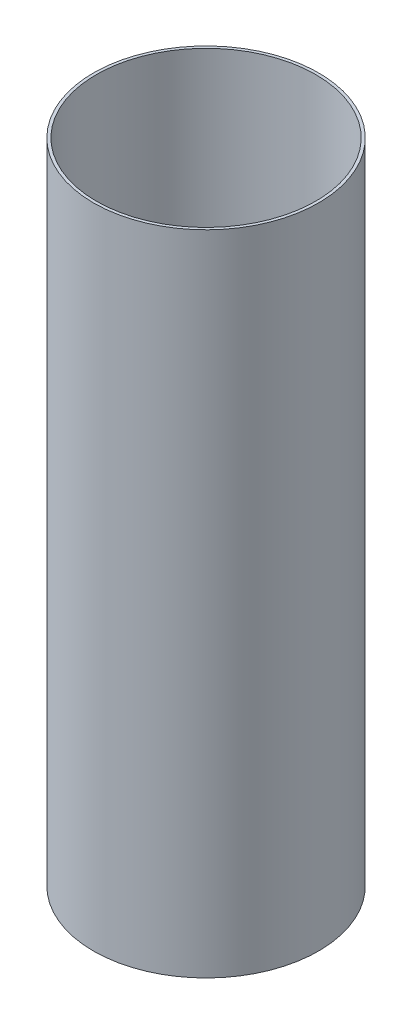
ISO-10303-21;
HEADER;
FILE_DESCRIPTION(('STEP AP214'),'2;1');
FILE_NAME('part.step','',(''),(''),'','','');
FILE_SCHEMA(('AUTOMOTIVE_DESIGN { 1 0 10303 214 1 1 1 1 }'));
ENDSEC;
DATA;
#1=APPLICATION_CONTEXT('core data for automotive mechanical design processes');
#2=APPLICATION_PROTOCOL_DEFINITION('international standard','automotive_design',2000,#1);
#3=PRODUCT_CONTEXT('',#1,'mechanical');
#4=PRODUCT('Part','Part','',(#3));
#5=PRODUCT_RELATED_PRODUCT_CATEGORY('part','',(#4));
#6=PRODUCT_DEFINITION_FORMATION('','',#4);
#7=PRODUCT_DEFINITION_CONTEXT('part definition',#1,'design');
#8=PRODUCT_DEFINITION('design','',#6,#7);
#9=PRODUCT_DEFINITION_SHAPE('','',#8);
#10=(LENGTH_UNIT() NAMED_UNIT(*) SI_UNIT(.MILLI.,.METRE.));
#11=(NAMED_UNIT(*) PLANE_ANGLE_UNIT() SI_UNIT($,.RADIAN.));
#12=(NAMED_UNIT(*) SI_UNIT($,.STERADIAN.) SOLID_ANGLE_UNIT());
#13=UNCERTAINTY_MEASURE_WITH_UNIT(LENGTH_MEASURE(1.E-05),#10,'distance_accuracy_value','');
#14=(GEOMETRIC_REPRESENTATION_CONTEXT(3) GLOBAL_UNCERTAINTY_ASSIGNED_CONTEXT((#13)) GLOBAL_UNIT_ASSIGNED_CONTEXT((#10,
#11,#12)) REPRESENTATION_CONTEXT('',''));
#15=CARTESIAN_POINT('',(0.,0.,0.));
#16=DIRECTION('',(0.,0.,1.));
#17=DIRECTION('',(1.,0.,0.));
#18=AXIS2_PLACEMENT_3D('',#15,#16,#17);
#19=CARTESIAN_POINT('',(0.,450.,0.));
#20=DIRECTION('',(0.,1.,0.));
#21=DIRECTION('',(0.,0.,1.));
#22=AXIS2_PLACEMENT_3D('',#19,#20,#21);
#23=PLANE('',#22);
#24=CARTESIAN_POINT('',(0.,450.,0.));
#25=DIRECTION('',(0.,1.,0.));
#26=DIRECTION('',(0.,0.,1.));
#27=AXIS2_PLACEMENT_3D('',#24,#25,#26);
#28=CIRCLE('',#27,78.2);
#29=CARTESIAN_POINT('',(0.,450.,78.2));
#30=VERTEX_POINT('',#29);
#31=EDGE_CURVE('E10',#30,#30,#28,.T.);
#32=ORIENTED_EDGE('',*,*,#31,.T.);
#33=EDGE_LOOP('',(#32));
#34=FACE_BOUND('',#33,.T.);
#35=CARTESIAN_POINT('',(0.,450.,0.));
#36=DIRECTION('',(0.,1.,0.));
#37=DIRECTION('',(0.,0.,1.));
#38=AXIS2_PLACEMENT_3D('',#35,#36,#37);
#39=CIRCLE('',#38,76.2);
#40=CARTESIAN_POINT('',(0.,450.,76.2));
#41=VERTEX_POINT('',#40);
#42=EDGE_CURVE('E50',#41,#41,#39,.T.);
#43=ORIENTED_EDGE('',*,*,#42,.F.);
#44=EDGE_LOOP('',(#43));
#45=FACE_BOUND('',#44,.T.);
#46=ADVANCED_FACE('F37',(#34,#45),#23,.T.);
#47=CARTESIAN_POINT('',(0.,0.,0.));
#48=DIRECTION('',(0.,1.,0.));
#49=DIRECTION('',(0.,0.,1.));
#50=AXIS2_PLACEMENT_3D('',#47,#48,#49);
#51=PLANE('',#50);
#52=CARTESIAN_POINT('',(0.,0.,0.));
#53=DIRECTION('',(0.,1.,0.));
#54=DIRECTION('',(0.,0.,1.));
#55=AXIS2_PLACEMENT_3D('',#52,#53,#54);
#56=CIRCLE('',#55,78.2);
#57=CARTESIAN_POINT('',(0.,0.,78.2));
#58=VERTEX_POINT('',#57);
#59=EDGE_CURVE('E41',#58,#58,#56,.T.);
#60=ORIENTED_EDGE('',*,*,#59,.F.);
#61=EDGE_LOOP('',(#60));
#62=FACE_BOUND('',#61,.T.);
#63=CARTESIAN_POINT('',(0.,0.,0.));
#64=DIRECTION('',(0.,1.,0.));
#65=DIRECTION('',(0.,0.,1.));
#66=AXIS2_PLACEMENT_3D('',#63,#64,#65);
#67=CIRCLE('',#66,76.2);
#68=CARTESIAN_POINT('',(0.,0.,76.2));
#69=VERTEX_POINT('',#68);
#70=EDGE_CURVE('E52',#69,#69,#67,.T.);
#71=ORIENTED_EDGE('',*,*,#70,.T.);
#72=EDGE_LOOP('',(#71));
#73=FACE_BOUND('',#72,.T.);
#74=ADVANCED_FACE('F64',(#62,#73),#51,.F.);
#75=CARTESIAN_POINT('',(0.,450.,0.));
#76=DIRECTION('',(0.,-1.,0.));
#77=DIRECTION('',(0.,0.,-1.));
#78=AXIS2_PLACEMENT_3D('',#75,#76,#77);
#79=CYLINDRICAL_SURFACE('',#78,78.2);
#80=ORIENTED_EDGE('',*,*,#31,.F.);
#81=EDGE_LOOP('',(#80));
#82=FACE_BOUND('',#81,.T.);
#83=ORIENTED_EDGE('',*,*,#59,.T.);
#84=EDGE_LOOP('',(#83));
#85=FACE_BOUND('',#84,.T.);
#86=ADVANCED_FACE('F39',(#82,#85),#79,.T.);
#87=CARTESIAN_POINT('',(0.,450.,0.));
#88=DIRECTION('',(0.,-1.,0.));
#89=DIRECTION('',(0.,0.,-1.));
#90=AXIS2_PLACEMENT_3D('',#87,#88,#89);
#91=CYLINDRICAL_SURFACE('',#90,76.2);
#92=ORIENTED_EDGE('',*,*,#42,.T.);
#93=EDGE_LOOP('',(#92));
#94=FACE_BOUND('',#93,.T.);
#95=ORIENTED_EDGE('',*,*,#70,.F.);
#96=EDGE_LOOP('',(#95));
#97=FACE_BOUND('',#96,.T.);
#98=ADVANCED_FACE('F60',(#94,#97),#91,.F.);
#99=CLOSED_SHELL('',(#46,#74,#86,#98));
#100=MANIFOLD_SOLID_BREP('B2',#99);
#101=ADVANCED_BREP_SHAPE_REPRESENTATION('',(#18,#100),#14);
#102=SHAPE_DEFINITION_REPRESENTATION(#9,#101);
ENDSEC;
END-ISO-10303-21;
